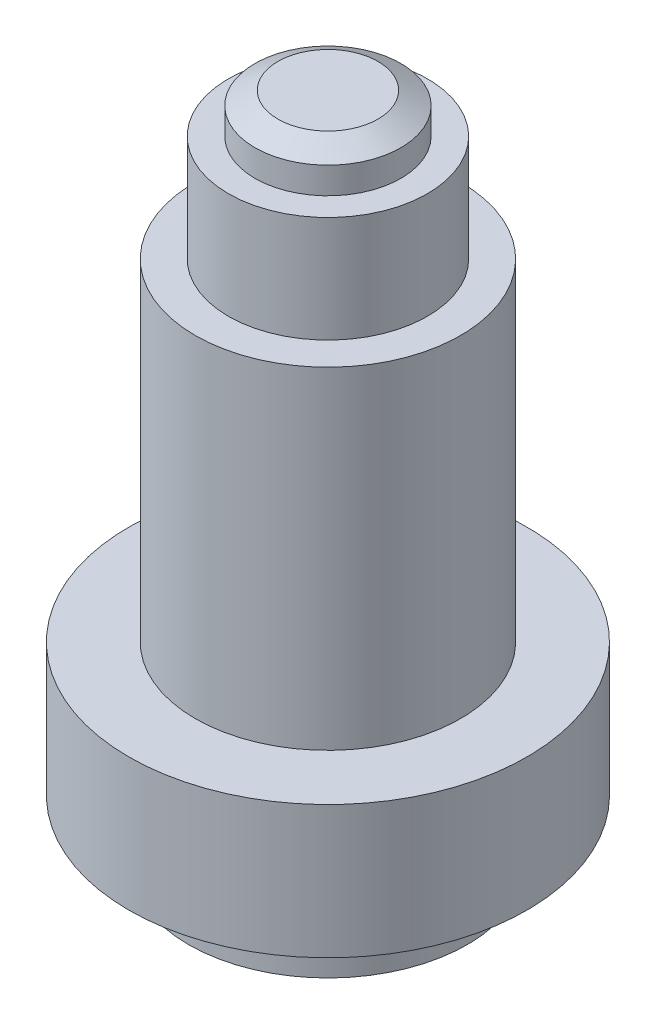
ISO-10303-21;
HEADER;
FILE_DESCRIPTION(('STEP AP214'),'2;1');
FILE_NAME('part.step','',(''),(''),'','','');
FILE_SCHEMA(('AUTOMOTIVE_DESIGN { 1 0 10303 214 1 1 1 1 }'));
ENDSEC;
DATA;
#1=APPLICATION_CONTEXT('core data for automotive mechanical design processes');
#2=APPLICATION_PROTOCOL_DEFINITION('international standard','automotive_design',2000,#1);
#3=PRODUCT_CONTEXT('',#1,'mechanical');
#4=PRODUCT('Part','Part','',(#3));
#5=PRODUCT_RELATED_PRODUCT_CATEGORY('part','',(#4));
#6=PRODUCT_DEFINITION_FORMATION('','',#4);
#7=PRODUCT_DEFINITION_CONTEXT('part definition',#1,'design');
#8=PRODUCT_DEFINITION('design','',#6,#7);
#9=PRODUCT_DEFINITION_SHAPE('','',#8);
#10=(LENGTH_UNIT() NAMED_UNIT(*) SI_UNIT(.MILLI.,.METRE.));
#11=(NAMED_UNIT(*) PLANE_ANGLE_UNIT() SI_UNIT($,.RADIAN.));
#12=(NAMED_UNIT(*) SI_UNIT($,.STERADIAN.) SOLID_ANGLE_UNIT());
#13=UNCERTAINTY_MEASURE_WITH_UNIT(LENGTH_MEASURE(1.E-05),#10,'distance_accuracy_value','');
#14=(GEOMETRIC_REPRESENTATION_CONTEXT(3) GLOBAL_UNCERTAINTY_ASSIGNED_CONTEXT((#13)) GLOBAL_UNIT_ASSIGNED_CONTEXT((#10,
#11,#12)) REPRESENTATION_CONTEXT('',''));
#15=CARTESIAN_POINT('',(0.,0.,0.));
#16=DIRECTION('',(0.,0.,1.));
#17=DIRECTION('',(1.,0.,0.));
#18=AXIS2_PLACEMENT_3D('',#15,#16,#17);
#19=CARTESIAN_POINT('',(0.,4.5,0.));
#20=DIRECTION('',(0.,-1.,0.));
#21=DIRECTION('',(0.,0.,-1.));
#22=AXIS2_PLACEMENT_3D('',#19,#20,#21);
#23=CYLINDRICAL_SURFACE('',#22,10.5);
#24=CARTESIAN_POINT('',(0.,4.5,0.));
#25=DIRECTION('',(0.,1.,0.));
#26=DIRECTION('',(0.,0.,1.));
#27=AXIS2_PLACEMENT_3D('',#24,#25,#26);
#28=CIRCLE('',#27,10.5);
#29=CARTESIAN_POINT('',(0.,4.5,10.5));
#30=VERTEX_POINT('',#29);
#31=EDGE_CURVE('E71',#30,#30,#28,.T.);
#32=ORIENTED_EDGE('',*,*,#31,.F.);
#33=EDGE_LOOP('',(#32));
#34=FACE_BOUND('',#33,.T.);
#35=CARTESIAN_POINT('',(0.,0.,0.));
#36=DIRECTION('',(0.,1.,0.));
#37=DIRECTION('',(0.,0.,1.));
#38=AXIS2_PLACEMENT_3D('',#35,#36,#37);
#39=CIRCLE('',#38,10.5);
#40=CARTESIAN_POINT('',(0.,0.,10.5));
#41=VERTEX_POINT('',#40);
#42=EDGE_CURVE('E67',#41,#41,#39,.T.);
#43=ORIENTED_EDGE('',*,*,#42,.T.);
#44=EDGE_LOOP('',(#43));
#45=FACE_BOUND('',#44,.T.);
#46=ADVANCED_FACE('F45',(#34,#45),#23,.T.);
#47=CARTESIAN_POINT('',(0.,0.,0.));
#48=DIRECTION('',(0.,1.,0.));
#49=DIRECTION('',(0.,0.,1.));
#50=AXIS2_PLACEMENT_3D('',#47,#48,#49);
#51=PLANE('',#50);
#52=ORIENTED_EDGE('',*,*,#42,.F.);
#53=EDGE_LOOP('',(#52));
#54=FACE_BOUND('',#53,.T.);
#55=ADVANCED_FACE('F129',(#54),#51,.F.);
#56=CARTESIAN_POINT('',(0.,14.5,0.));
#57=DIRECTION('',(0.,-1.,0.));
#58=DIRECTION('',(0.,0.,-1.));
#59=AXIS2_PLACEMENT_3D('',#56,#57,#58);
#60=CYLINDRICAL_SURFACE('',#59,15.);
#61=CARTESIAN_POINT('',(0.,14.5,0.));
#62=DIRECTION('',(0.,1.,0.));
#63=DIRECTION('',(0.,0.,1.));
#64=AXIS2_PLACEMENT_3D('',#61,#62,#63);
#65=CIRCLE('',#64,15.);
#66=CARTESIAN_POINT('',(0.,14.5,15.));
#67=VERTEX_POINT('',#66);
#68=EDGE_CURVE('E72',#67,#67,#65,.T.);
#69=ORIENTED_EDGE('',*,*,#68,.F.);
#70=EDGE_LOOP('',(#69));
#71=FACE_BOUND('',#70,.T.);
#72=CARTESIAN_POINT('',(0.,4.5,0.));
#73=DIRECTION('',(0.,1.,0.));
#74=DIRECTION('',(0.,0.,1.));
#75=AXIS2_PLACEMENT_3D('',#72,#73,#74);
#76=CIRCLE('',#75,15.);
#77=CARTESIAN_POINT('',(0.,4.5,15.));
#78=VERTEX_POINT('',#77);
#79=EDGE_CURVE('E77',#78,#78,#76,.T.);
#80=ORIENTED_EDGE('',*,*,#79,.T.);
#81=EDGE_LOOP('',(#80));
#82=FACE_BOUND('',#81,.T.);
#83=ADVANCED_FACE('F123',(#71,#82),#60,.T.);
#84=CARTESIAN_POINT('',(0.,14.5,0.));
#85=DIRECTION('',(0.,1.,0.));
#86=DIRECTION('',(0.,0.,1.));
#87=AXIS2_PLACEMENT_3D('',#84,#85,#86);
#88=PLANE('',#87);
#89=CARTESIAN_POINT('',(0.,14.5,0.));
#90=DIRECTION('',(0.,1.,0.));
#91=DIRECTION('',(0.,0.,1.));
#92=AXIS2_PLACEMENT_3D('',#89,#90,#91);
#93=CIRCLE('',#92,10.);
#94=CARTESIAN_POINT('',(0.,14.5,10.));
#95=VERTEX_POINT('',#94);
#96=EDGE_CURVE('E76',#95,#95,#93,.T.);
#97=ORIENTED_EDGE('',*,*,#96,.F.);
#98=EDGE_LOOP('',(#97));
#99=FACE_BOUND('',#98,.T.);
#100=ORIENTED_EDGE('',*,*,#68,.T.);
#101=EDGE_LOOP('',(#100));
#102=FACE_BOUND('',#101,.T.);
#103=ADVANCED_FACE('F120',(#99,#102),#88,.T.);
#104=CARTESIAN_POINT('',(0.,4.5,0.));
#105=DIRECTION('',(0.,1.,0.));
#106=DIRECTION('',(0.,0.,1.));
#107=AXIS2_PLACEMENT_3D('',#104,#105,#106);
#108=PLANE('',#107);
#109=ORIENTED_EDGE('',*,*,#31,.T.);
#110=EDGE_LOOP('',(#109));
#111=FACE_BOUND('',#110,.T.);
#112=ORIENTED_EDGE('',*,*,#79,.F.);
#113=EDGE_LOOP('',(#112));
#114=FACE_BOUND('',#113,.T.);
#115=ADVANCED_FACE('F116',(#111,#114),#108,.F.);
#116=CARTESIAN_POINT('',(0.,39.5,0.));
#117=DIRECTION('',(0.,-1.,0.));
#118=DIRECTION('',(0.,0.,-1.));
#119=AXIS2_PLACEMENT_3D('',#116,#117,#118);
#120=CYLINDRICAL_SURFACE('',#119,10.);
#121=CARTESIAN_POINT('',(0.,39.5,0.));
#122=DIRECTION('',(0.,1.,0.));
#123=DIRECTION('',(0.,0.,1.));
#124=AXIS2_PLACEMENT_3D('',#121,#122,#123);
#125=CIRCLE('',#124,10.);
#126=CARTESIAN_POINT('',(0.,39.5,10.));
#127=VERTEX_POINT('',#126);
#128=EDGE_CURVE('E81',#127,#127,#125,.T.);
#129=ORIENTED_EDGE('',*,*,#128,.F.);
#130=EDGE_LOOP('',(#129));
#131=FACE_BOUND('',#130,.T.);
#132=ORIENTED_EDGE('',*,*,#96,.T.);
#133=EDGE_LOOP('',(#132));
#134=FACE_BOUND('',#133,.T.);
#135=ADVANCED_FACE('F110',(#131,#134),#120,.T.);
#136=CARTESIAN_POINT('',(0.,39.5,0.));
#137=DIRECTION('',(0.,1.,0.));
#138=DIRECTION('',(0.,0.,1.));
#139=AXIS2_PLACEMENT_3D('',#136,#137,#138);
#140=PLANE('',#139);
#141=CARTESIAN_POINT('',(0.,39.5,0.));
#142=DIRECTION('',(0.,1.,0.));
#143=DIRECTION('',(0.,0.,1.));
#144=AXIS2_PLACEMENT_3D('',#141,#142,#143);
#145=CIRCLE('',#144,7.5);
#146=CARTESIAN_POINT('',(0.,39.5,7.5));
#147=VERTEX_POINT('',#146);
#148=EDGE_CURVE('E64',#147,#147,#145,.T.);
#149=ORIENTED_EDGE('',*,*,#148,.F.);
#150=EDGE_LOOP('',(#149));
#151=FACE_BOUND('',#150,.T.);
#152=ORIENTED_EDGE('',*,*,#128,.T.);
#153=EDGE_LOOP('',(#152));
#154=FACE_BOUND('',#153,.T.);
#155=ADVANCED_FACE('F104',(#151,#154),#140,.T.);
#156=CARTESIAN_POINT('',(0.,47.5,0.));
#157=DIRECTION('',(0.,-1.,0.));
#158=DIRECTION('',(0.,0.,-1.));
#159=AXIS2_PLACEMENT_3D('',#156,#157,#158);
#160=CYLINDRICAL_SURFACE('',#159,7.5);
#161=CARTESIAN_POINT('',(0.,47.5,0.));
#162=DIRECTION('',(0.,1.,0.));
#163=DIRECTION('',(0.,0.,1.));
#164=AXIS2_PLACEMENT_3D('',#161,#162,#163);
#165=CIRCLE('',#164,7.5);
#166=CARTESIAN_POINT('',(0.,47.5,7.5));
#167=VERTEX_POINT('',#166);
#168=EDGE_CURVE('E91',#167,#167,#165,.T.);
#169=ORIENTED_EDGE('',*,*,#168,.F.);
#170=EDGE_LOOP('',(#169));
#171=FACE_BOUND('',#170,.T.);
#172=ORIENTED_EDGE('',*,*,#148,.T.);
#173=EDGE_LOOP('',(#172));
#174=FACE_BOUND('',#173,.T.);
#175=ADVANCED_FACE('F101',(#171,#174),#160,.T.);
#176=CARTESIAN_POINT('',(0.,47.5,0.));
#177=DIRECTION('',(0.,1.,0.));
#178=DIRECTION('',(0.,0.,1.));
#179=AXIS2_PLACEMENT_3D('',#176,#177,#178);
#180=PLANE('',#179);
#181=CARTESIAN_POINT('',(0.,47.5,0.));
#182=DIRECTION('',(0.,1.,0.));
#183=DIRECTION('',(0.,0.,1.));
#184=AXIS2_PLACEMENT_3D('',#181,#182,#183);
#185=CIRCLE('',#184,5.5);
#186=CARTESIAN_POINT('',(0.,47.5,5.5));
#187=VERTEX_POINT('',#186);
#188=EDGE_CURVE('E59',#187,#187,#185,.T.);
#189=ORIENTED_EDGE('',*,*,#188,.F.);
#190=EDGE_LOOP('',(#189));
#191=FACE_BOUND('',#190,.T.);
#192=ORIENTED_EDGE('',*,*,#168,.T.);
#193=EDGE_LOOP('',(#192));
#194=FACE_BOUND('',#193,.T.);
#195=ADVANCED_FACE('F99',(#191,#194),#180,.T.);
#196=CARTESIAN_POINT('',(0.,50.5,0.));
#197=DIRECTION('',(0.,-1.,0.));
#198=DIRECTION('',(0.,0.,-1.));
#199=AXIS2_PLACEMENT_3D('',#196,#197,#198);
#200=CYLINDRICAL_SURFACE('',#199,5.5);
#201=CARTESIAN_POINT('',(0.,49.5,0.));
#202=DIRECTION('',(0.,1.,0.));
#203=DIRECTION('',(0.,0.,1.));
#204=AXIS2_PLACEMENT_3D('',#201,#202,#203);
#205=CIRCLE('',#204,5.5);
#206=CARTESIAN_POINT('',(0.,49.5,5.5));
#207=VERTEX_POINT('',#206);
#208=EDGE_CURVE('E10',#207,#207,#205,.F.);
#209=ORIENTED_EDGE('',*,*,#208,.T.);
#210=EDGE_LOOP('',(#209));
#211=FACE_BOUND('',#210,.T.);
#212=ORIENTED_EDGE('',*,*,#188,.T.);
#213=EDGE_LOOP('',(#212));
#214=FACE_BOUND('',#213,.T.);
#215=ADVANCED_FACE('F193',(#211,#214),#200,.T.);
#216=CARTESIAN_POINT('',(0.,50.5,0.));
#217=DIRECTION('',(0.,1.,0.));
#218=DIRECTION('',(0.,0.,1.));
#219=AXIS2_PLACEMENT_3D('',#216,#217,#218);
#220=PLANE('',#219);
#221=CARTESIAN_POINT('',(0.,50.5,0.));
#222=DIRECTION('',(0.,1.,0.));
#223=DIRECTION('',(0.,0.,1.));
#224=AXIS2_PLACEMENT_3D('',#221,#222,#223);
#225=CIRCLE('',#224,3.76794919243111);
#226=CARTESIAN_POINT('',(0.,50.5,3.76794919243111));
#227=VERTEX_POINT('',#226);
#228=EDGE_CURVE('E54',#227,#227,#225,.T.);
#229=ORIENTED_EDGE('',*,*,#228,.T.);
#230=EDGE_LOOP('',(#229));
#231=FACE_BOUND('',#230,.T.);
#232=ADVANCED_FACE('F203',(#231),#220,.T.);
#233=CARTESIAN_POINT('',(0.,50.5,0.));
#234=DIRECTION('',(0.,-1.,0.));
#235=DIRECTION('',(0.,0.,-1.));
#236=AXIS2_PLACEMENT_3D('',#233,#234,#235);
#237=CONICAL_SURFACE('',#236,3.76794919243111,1.0471975511966);
#238=ORIENTED_EDGE('',*,*,#208,.F.);
#239=EDGE_LOOP('',(#238));
#240=FACE_BOUND('',#239,.T.);
#241=ORIENTED_EDGE('',*,*,#228,.F.);
#242=EDGE_LOOP('',(#241));
#243=FACE_BOUND('',#242,.T.);
#244=ADVANCED_FACE('F48',(#240,#243),#237,.T.);
#245=CLOSED_SHELL('',(#46,#55,#83,#103,#115,#135,#155,#175,#195,#215,#232,#244));
#246=MANIFOLD_SOLID_BREP('B2',#245);
#247=ADVANCED_BREP_SHAPE_REPRESENTATION('',(#18,#246),#14);
#248=SHAPE_DEFINITION_REPRESENTATION(#9,#247);
ENDSEC;
END-ISO-10303-21;
